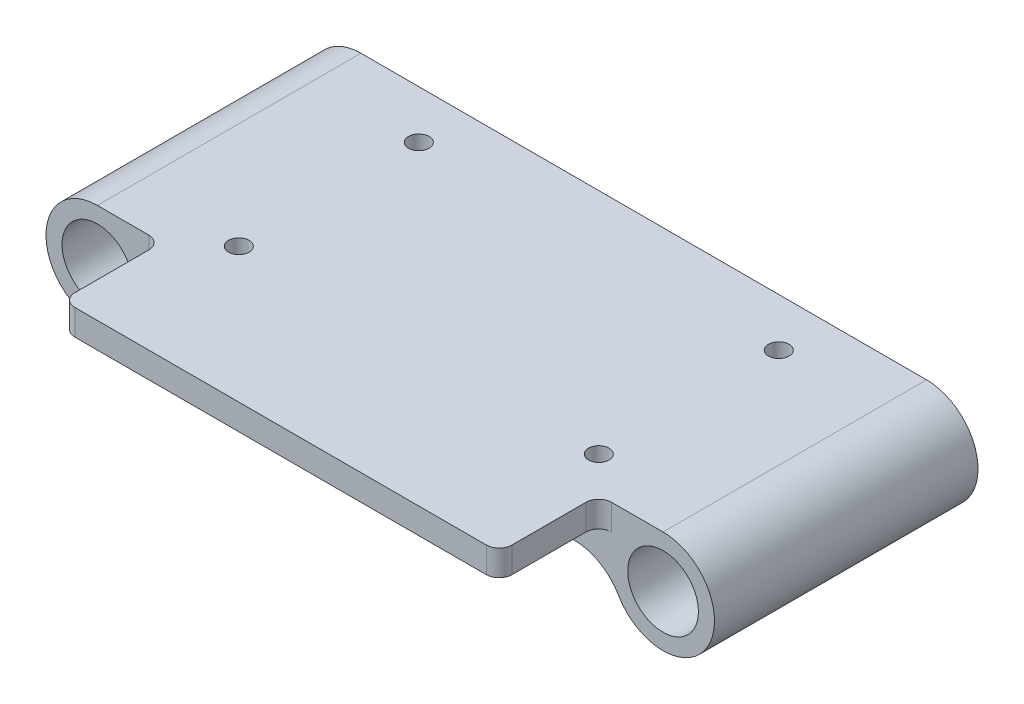
ISO-10303-21;
HEADER;
FILE_DESCRIPTION(('STEP AP214'),'2;1');
FILE_NAME('part.step','',(''),(''),'','','');
FILE_SCHEMA(('AUTOMOTIVE_DESIGN { 1 0 10303 214 1 1 1 1 }'));
ENDSEC;
DATA;
#1=APPLICATION_CONTEXT('core data for automotive mechanical design processes');
#2=APPLICATION_PROTOCOL_DEFINITION('international standard','automotive_design',2000,#1);
#3=PRODUCT_CONTEXT('',#1,'mechanical');
#4=PRODUCT('Part','Part','',(#3));
#5=PRODUCT_RELATED_PRODUCT_CATEGORY('part','',(#4));
#6=PRODUCT_DEFINITION_FORMATION('','',#4);
#7=PRODUCT_DEFINITION_CONTEXT('part definition',#1,'design');
#8=PRODUCT_DEFINITION('design','',#6,#7);
#9=PRODUCT_DEFINITION_SHAPE('','',#8);
#10=(LENGTH_UNIT() NAMED_UNIT(*) SI_UNIT(.MILLI.,.METRE.));
#11=(NAMED_UNIT(*) PLANE_ANGLE_UNIT() SI_UNIT($,.RADIAN.));
#12=(NAMED_UNIT(*) SI_UNIT($,.STERADIAN.) SOLID_ANGLE_UNIT());
#13=UNCERTAINTY_MEASURE_WITH_UNIT(LENGTH_MEASURE(1.E-05),#10,'distance_accuracy_value','');
#14=(GEOMETRIC_REPRESENTATION_CONTEXT(3) GLOBAL_UNCERTAINTY_ASSIGNED_CONTEXT((#13)) GLOBAL_UNIT_ASSIGNED_CONTEXT((#10,
#11,#12)) REPRESENTATION_CONTEXT('',''));
#15=CARTESIAN_POINT('',(0.,0.,0.));
#16=DIRECTION('',(0.,0.,1.));
#17=DIRECTION('',(1.,0.,0.));
#18=AXIS2_PLACEMENT_3D('',#15,#16,#17);
#19=CARTESIAN_POINT('',(-22.,0.,10.25));
#20=DIRECTION('',(0.,0.,-1.));
#21=DIRECTION('',(-1.,0.,0.));
#22=AXIS2_PLACEMENT_3D('',#19,#20,#21);
#23=CYLINDRICAL_SURFACE('',#22,4.);
#24=CARTESIAN_POINT('',(-22.,0.,-10.25));
#25=DIRECTION('',(0.,0.,1.));
#26=DIRECTION('',(1.,0.,0.));
#27=AXIS2_PLACEMENT_3D('',#24,#25,#26);
#28=CIRCLE('',#27,4.);
#29=CARTESIAN_POINT('',(-22.,4.,-10.25));
#30=VERTEX_POINT('',#29);
#31=CARTESIAN_POINT('',(-18.5358983848622,-2.,-10.25));
#32=VERTEX_POINT('',#31);
#33=EDGE_CURVE('E192',#30,#32,#28,.T.);
#34=ORIENTED_EDGE('',*,*,#33,.T.);
#35=DIRECTION('',(0.,0.,-1.));
#36=VECTOR('',#35,1.);
#37=CARTESIAN_POINT('',(-18.5358983848622,-2.,10.25));
#38=LINE('',#37,#36);
#39=CARTESIAN_POINT('',(-18.5358983848622,-2.,10.25));
#40=VERTEX_POINT('',#39);
#41=EDGE_CURVE('E217',#32,#40,#38,.F.);
#42=ORIENTED_EDGE('',*,*,#41,.T.);
#43=CARTESIAN_POINT('',(-22.,0.,10.25));
#44=DIRECTION('',(0.,0.,1.));
#45=DIRECTION('',(1.,0.,0.));
#46=AXIS2_PLACEMENT_3D('',#43,#44,#45);
#47=CIRCLE('',#46,4.);
#48=CARTESIAN_POINT('',(-22.,4.,10.25));
#49=VERTEX_POINT('',#48);
#50=EDGE_CURVE('E186',#49,#40,#47,.T.);
#51=ORIENTED_EDGE('',*,*,#50,.F.);
#52=DIRECTION('',(0.,0.,-1.));
#53=VECTOR('',#52,1.);
#54=CARTESIAN_POINT('',(-22.,4.,10.25));
#55=LINE('',#54,#53);
#56=EDGE_CURVE('E175',#49,#30,#55,.T.);
#57=ORIENTED_EDGE('',*,*,#56,.T.);
#58=EDGE_LOOP('',(#34,#42,#51,#57));
#59=FACE_BOUND('',#58,.T.);
#60=ADVANCED_FACE('F45',(#59),#23,.T.);
#61=CARTESIAN_POINT('',(0.,0.,10.25));
#62=DIRECTION('',(0.,-1.,0.));
#63=DIRECTION('',(0.,0.,-1.));
#64=AXIS2_PLACEMENT_3D('',#61,#62,#63);
#65=PLANE('',#64);
#66=CARTESIAN_POINT('',(14.25,0.,-6.500000018));
#67=DIRECTION('',(0.,-1.,0.));
#68=DIRECTION('',(0.,0.,-1.));
#69=AXIS2_PLACEMENT_3D('',#66,#67,#68);
#70=CIRCLE('',#69,0.799999999999999);
#71=CARTESIAN_POINT('',(14.25,0.,-7.300000018));
#72=VERTEX_POINT('',#71);
#73=EDGE_CURVE('E354',#72,#72,#70,.T.);
#74=ORIENTED_EDGE('',*,*,#73,.F.);
#75=EDGE_LOOP('',(#74));
#76=FACE_BOUND('',#75,.T.);
#77=CARTESIAN_POINT('',(14.25,0.,7.499999982));
#78=DIRECTION('',(0.,-1.,0.));
#79=DIRECTION('',(0.,0.,-1.));
#80=AXIS2_PLACEMENT_3D('',#77,#78,#79);
#81=CIRCLE('',#80,0.799999999999999);
#82=CARTESIAN_POINT('',(14.25,0.,6.699999982));
#83=VERTEX_POINT('',#82);
#84=EDGE_CURVE('E346',#83,#83,#81,.T.);
#85=ORIENTED_EDGE('',*,*,#84,.F.);
#86=EDGE_LOOP('',(#85));
#87=FACE_BOUND('',#86,.T.);
#88=CARTESIAN_POINT('',(-13.75,0.,7.499999982));
#89=DIRECTION('',(0.,-1.,0.));
#90=DIRECTION('',(0.,0.,-1.));
#91=AXIS2_PLACEMENT_3D('',#88,#89,#90);
#92=CIRCLE('',#91,0.799999999999999);
#93=CARTESIAN_POINT('',(-13.75,0.,6.69999998200001));
#94=VERTEX_POINT('',#93);
#95=EDGE_CURVE('E338',#94,#94,#92,.T.);
#96=ORIENTED_EDGE('',*,*,#95,.F.);
#97=EDGE_LOOP('',(#96));
#98=FACE_BOUND('',#97,.T.);
#99=CARTESIAN_POINT('',(-13.75,0.,-6.500000018));
#100=DIRECTION('',(0.,-1.,0.));
#101=DIRECTION('',(0.,0.,-1.));
#102=AXIS2_PLACEMENT_3D('',#99,#100,#101);
#103=CIRCLE('',#102,0.799999999999999);
#104=CARTESIAN_POINT('',(-13.75,0.,-7.300000018));
#105=VERTEX_POINT('',#104);
#106=EDGE_CURVE('E330',#105,#105,#103,.T.);
#107=ORIENTED_EDGE('',*,*,#106,.F.);
#108=EDGE_LOOP('',(#107));
#109=FACE_BOUND('',#108,.T.);
#110=DIRECTION('',(-1.,0.,0.));
#111=VECTOR('',#110,1.);
#112=CARTESIAN_POINT('',(0.,0.,-10.25));
#113=LINE('',#112,#111);
#114=CARTESIAN_POINT('',(15.0717967697245,0.,-10.25));
#115=VERTEX_POINT('',#114);
#116=CARTESIAN_POINT('',(-15.0717967697245,0.,-10.25));
#117=VERTEX_POINT('',#116);
#118=EDGE_CURVE('E196',#115,#117,#113,.T.);
#119=ORIENTED_EDGE('',*,*,#118,.F.);
#120=DIRECTION('',(0.,0.,1.));
#121=VECTOR('',#120,1.);
#122=CARTESIAN_POINT('',(15.0717967697245,0.,10.25));
#123=LINE('',#122,#121);
#124=CARTESIAN_POINT('',(15.0717967697245,0.,10.25));
#125=VERTEX_POINT('',#124);
#126=EDGE_CURVE('E214',#115,#125,#123,.T.);
#127=ORIENTED_EDGE('',*,*,#126,.T.);
#128=DIRECTION('',(-1.,0.,0.));
#129=VECTOR('',#128,1.);
#130=CARTESIAN_POINT('',(0.,0.,10.25));
#131=LINE('',#130,#129);
#132=CARTESIAN_POINT('',(-15.0717967697245,0.,10.25));
#133=VERTEX_POINT('',#132);
#134=EDGE_CURVE('E182',#125,#133,#131,.T.);
#135=ORIENTED_EDGE('',*,*,#134,.T.);
#136=DIRECTION('',(0.,0.,-1.));
#137=VECTOR('',#136,1.);
#138=CARTESIAN_POINT('',(-15.0717967697245,0.,10.25));
#139=LINE('',#138,#137);
#140=EDGE_CURVE('E210',#133,#117,#139,.T.);
#141=ORIENTED_EDGE('',*,*,#140,.T.);
#142=EDGE_LOOP('',(#119,#127,#135,#141));
#143=FACE_BOUND('',#142,.T.);
#144=ADVANCED_FACE('F391',(#76,#87,#98,#109,#143),#65,.T.);
#145=CARTESIAN_POINT('',(22.,0.,10.25));
#146=DIRECTION('',(0.,0.,-1.));
#147=DIRECTION('',(-1.,0.,0.));
#148=AXIS2_PLACEMENT_3D('',#145,#146,#147);
#149=CYLINDRICAL_SURFACE('',#148,4.);
#150=CARTESIAN_POINT('',(22.,0.,10.25));
#151=DIRECTION('',(0.,0.,1.));
#152=DIRECTION('',(1.,0.,0.));
#153=AXIS2_PLACEMENT_3D('',#150,#151,#152);
#154=CIRCLE('',#153,4.);
#155=CARTESIAN_POINT('',(22.,4.,10.25));
#156=VERTEX_POINT('',#155);
#157=CARTESIAN_POINT('',(18.5358983848622,-2.,10.25));
#158=VERTEX_POINT('',#157);
#159=EDGE_CURVE('E163',#156,#158,#154,.F.);
#160=ORIENTED_EDGE('',*,*,#159,.T.);
#161=DIRECTION('',(0.,0.,-1.));
#162=VECTOR('',#161,1.);
#163=CARTESIAN_POINT('',(18.5358983848622,-2.,10.25));
#164=LINE('',#163,#162);
#165=CARTESIAN_POINT('',(18.5358983848622,-2.,-10.25));
#166=VERTEX_POINT('',#165);
#167=EDGE_CURVE('E174',#158,#166,#164,.T.);
#168=ORIENTED_EDGE('',*,*,#167,.T.);
#169=CARTESIAN_POINT('',(22.,0.,-10.25));
#170=DIRECTION('',(0.,0.,1.));
#171=DIRECTION('',(1.,0.,0.));
#172=AXIS2_PLACEMENT_3D('',#169,#170,#171);
#173=CIRCLE('',#172,4.);
#174=CARTESIAN_POINT('',(22.,4.,-10.25));
#175=VERTEX_POINT('',#174);
#176=EDGE_CURVE('E171',#175,#166,#173,.F.);
#177=ORIENTED_EDGE('',*,*,#176,.F.);
#178=DIRECTION('',(0.,0.,-1.));
#179=VECTOR('',#178,1.);
#180=CARTESIAN_POINT('',(22.,4.,10.25));
#181=LINE('',#180,#179);
#182=EDGE_CURVE('E152',#156,#175,#181,.T.);
#183=ORIENTED_EDGE('',*,*,#182,.F.);
#184=EDGE_LOOP('',(#160,#168,#177,#183));
#185=FACE_BOUND('',#184,.T.);
#186=ADVANCED_FACE('F167',(#185),#149,.T.);
#187=CARTESIAN_POINT('',(0.,4.,10.25));
#188=DIRECTION('',(0.,1.,0.));
#189=DIRECTION('',(-1.,0.,0.));
#190=AXIS2_PLACEMENT_3D('',#187,#188,#189);
#191=PLANE('',#190);
#192=CARTESIAN_POINT('',(14.25,4.,-6.500000018));
#193=DIRECTION('',(0.,1.,0.));
#194=DIRECTION('',(0.,0.,1.));
#195=AXIS2_PLACEMENT_3D('',#192,#193,#194);
#196=CIRCLE('',#195,0.799999999999999);
#197=CARTESIAN_POINT('',(14.25,4.,-5.700000018));
#198=VERTEX_POINT('',#197);
#199=EDGE_CURVE('E358',#198,#198,#196,.T.);
#200=ORIENTED_EDGE('',*,*,#199,.F.);
#201=EDGE_LOOP('',(#200));
#202=FACE_BOUND('',#201,.T.);
#203=CARTESIAN_POINT('',(14.25,4.,7.499999982));
#204=DIRECTION('',(0.,1.,0.));
#205=DIRECTION('',(0.,0.,1.));
#206=AXIS2_PLACEMENT_3D('',#203,#204,#205);
#207=CIRCLE('',#206,0.799999999999999);
#208=CARTESIAN_POINT('',(14.25,4.,8.299999982));
#209=VERTEX_POINT('',#208);
#210=EDGE_CURVE('E350',#209,#209,#207,.T.);
#211=ORIENTED_EDGE('',*,*,#210,.F.);
#212=EDGE_LOOP('',(#211));
#213=FACE_BOUND('',#212,.T.);
#214=CARTESIAN_POINT('',(-13.75,4.,7.499999982));
#215=DIRECTION('',(0.,1.,0.));
#216=DIRECTION('',(0.,0.,1.));
#217=AXIS2_PLACEMENT_3D('',#214,#215,#216);
#218=CIRCLE('',#217,0.799999999999999);
#219=CARTESIAN_POINT('',(-13.75,4.,8.299999982));
#220=VERTEX_POINT('',#219);
#221=EDGE_CURVE('E342',#220,#220,#218,.T.);
#222=ORIENTED_EDGE('',*,*,#221,.F.);
#223=EDGE_LOOP('',(#222));
#224=FACE_BOUND('',#223,.T.);
#225=CARTESIAN_POINT('',(-13.75,4.,-6.500000018));
#226=DIRECTION('',(0.,1.,0.));
#227=DIRECTION('',(0.,0.,1.));
#228=AXIS2_PLACEMENT_3D('',#225,#226,#227);
#229=CIRCLE('',#228,0.799999999999999);
#230=CARTESIAN_POINT('',(-13.75,4.,-5.700000018));
#231=VERTEX_POINT('',#230);
#232=EDGE_CURVE('E334',#231,#231,#229,.T.);
#233=ORIENTED_EDGE('',*,*,#232,.F.);
#234=EDGE_LOOP('',(#233));
#235=FACE_BOUND('',#234,.T.);
#236=DIRECTION('',(0.,0.,1.));
#237=VECTOR('',#236,1.);
#238=CARTESIAN_POINT('',(-17.,4.,0.));
#239=LINE('',#238,#237);
#240=CARTESIAN_POINT('',(-17.,4.,11.25));
#241=VERTEX_POINT('',#240);
#242=CARTESIAN_POINT('',(-16.9999999999999,4.,17.));
#243=VERTEX_POINT('',#242);
#244=EDGE_CURVE('E297',#241,#243,#239,.T.);
#245=ORIENTED_EDGE('',*,*,#244,.T.);
#246=CARTESIAN_POINT('',(-15.9999999999999,4.,17.));
#247=DIRECTION('',(0.,1.,0.));
#248=DIRECTION('',(-1.,0.,0.));
#249=AXIS2_PLACEMENT_3D('',#246,#247,#248);
#250=CIRCLE('',#249,1.);
#251=CARTESIAN_POINT('',(-15.9999999999999,3.99999999999999,18.));
#252=VERTEX_POINT('',#251);
#253=EDGE_CURVE('E264',#243,#252,#250,.T.);
#254=ORIENTED_EDGE('',*,*,#253,.T.);
#255=DIRECTION('',(1.,0.,0.));
#256=VECTOR('',#255,1.);
#257=CARTESIAN_POINT('',(0.,4.,18.));
#258=LINE('',#257,#256);
#259=CARTESIAN_POINT('',(15.9999999999999,4.,18.));
#260=VERTEX_POINT('',#259);
#261=EDGE_CURVE('E197',#252,#260,#258,.T.);
#262=ORIENTED_EDGE('',*,*,#261,.T.);
#263=CARTESIAN_POINT('',(15.9999999999999,4.,17.));
#264=DIRECTION('',(0.,1.,0.));
#265=DIRECTION('',(-1.,0.,0.));
#266=AXIS2_PLACEMENT_3D('',#263,#264,#265);
#267=CIRCLE('',#266,1.);
#268=CARTESIAN_POINT('',(16.9999999999999,4.,17.));
#269=VERTEX_POINT('',#268);
#270=EDGE_CURVE('E261',#260,#269,#267,.T.);
#271=ORIENTED_EDGE('',*,*,#270,.T.);
#272=DIRECTION('',(0.,0.,1.));
#273=VECTOR('',#272,1.);
#274=CARTESIAN_POINT('',(17.,4.,0.));
#275=LINE('',#274,#273);
#276=CARTESIAN_POINT('',(17.,4.,11.25));
#277=VERTEX_POINT('',#276);
#278=EDGE_CURVE('E298',#277,#269,#275,.T.);
#279=ORIENTED_EDGE('',*,*,#278,.F.);
#280=CARTESIAN_POINT('',(18.,4.,11.25));
#281=DIRECTION('',(0.,1.,0.));
#282=DIRECTION('',(-1.,0.,0.));
#283=AXIS2_PLACEMENT_3D('',#280,#281,#282);
#284=CIRCLE('',#283,1.);
#285=CARTESIAN_POINT('',(18.,4.,10.25));
#286=VERTEX_POINT('',#285);
#287=EDGE_CURVE('E156',#277,#286,#284,.F.);
#288=ORIENTED_EDGE('',*,*,#287,.T.);
#289=DIRECTION('',(1.,0.,0.));
#290=VECTOR('',#289,1.);
#291=CARTESIAN_POINT('',(0.,4.,10.25));
#292=LINE('',#291,#290);
#293=EDGE_CURVE('E147',#286,#156,#292,.T.);
#294=ORIENTED_EDGE('',*,*,#293,.T.);
#295=ORIENTED_EDGE('',*,*,#182,.T.);
#296=DIRECTION('',(1.,0.,0.));
#297=VECTOR('',#296,1.);
#298=CARTESIAN_POINT('',(0.,4.,-10.25));
#299=LINE('',#298,#297);
#300=EDGE_CURVE('E203',#30,#175,#299,.T.);
#301=ORIENTED_EDGE('',*,*,#300,.F.);
#302=ORIENTED_EDGE('',*,*,#56,.F.);
#303=CARTESIAN_POINT('',(-18.,4.,10.25));
#304=VERTEX_POINT('',#303);
#305=EDGE_CURVE('E162',#49,#304,#292,.T.);
#306=ORIENTED_EDGE('',*,*,#305,.T.);
#307=CARTESIAN_POINT('',(-18.,4.,11.25));
#308=DIRECTION('',(0.,1.,0.));
#309=DIRECTION('',(-1.,0.,0.));
#310=AXIS2_PLACEMENT_3D('',#307,#308,#309);
#311=CIRCLE('',#310,1.);
#312=EDGE_CURVE('E11',#304,#241,#311,.F.);
#313=ORIENTED_EDGE('',*,*,#312,.T.);
#314=EDGE_LOOP('',(#245,#254,#262,#271,#279,#288,#294,#295,#301,#302,#306,#313));
#315=FACE_BOUND('',#314,.T.);
#316=ADVANCED_FACE('F150',(#202,#213,#224,#235,#315),#191,.T.);
#317=CARTESIAN_POINT('',(0.,0.,10.25));
#318=DIRECTION('',(0.,0.,1.));
#319=DIRECTION('',(1.,0.,0.));
#320=AXIS2_PLACEMENT_3D('',#317,#318,#319);
#321=PLANE('',#320);
#322=CARTESIAN_POINT('',(-22.,0.,10.25));
#323=DIRECTION('',(0.,0.,1.));
#324=DIRECTION('',(1.,0.,0.));
#325=AXIS2_PLACEMENT_3D('',#322,#323,#324);
#326=CIRCLE('',#325,2.75);
#327=CARTESIAN_POINT('',(-19.25,0.,10.25));
#328=VERTEX_POINT('',#327);
#329=EDGE_CURVE('E326',#328,#328,#326,.T.);
#330=ORIENTED_EDGE('',*,*,#329,.F.);
#331=EDGE_LOOP('',(#330));
#332=FACE_BOUND('',#331,.T.);
#333=CARTESIAN_POINT('',(22.,0.,10.25));
#334=DIRECTION('',(0.,0.,1.));
#335=DIRECTION('',(1.,0.,0.));
#336=AXIS2_PLACEMENT_3D('',#333,#334,#335);
#337=CIRCLE('',#336,2.75);
#338=CARTESIAN_POINT('',(24.75,0.,10.25));
#339=VERTEX_POINT('',#338);
#340=EDGE_CURVE('E318',#339,#339,#337,.T.);
#341=ORIENTED_EDGE('',*,*,#340,.F.);
#342=EDGE_LOOP('',(#341));
#343=FACE_BOUND('',#342,.T.);
#344=ORIENTED_EDGE('',*,*,#293,.F.);
#345=DIRECTION('',(0.,-1.,0.));
#346=VECTOR('',#345,1.);
#347=CARTESIAN_POINT('',(18.,2.,10.25));
#348=LINE('',#347,#346);
#349=CARTESIAN_POINT('',(18.,2.,10.25));
#350=VERTEX_POINT('',#349);
#351=EDGE_CURVE('E234',#286,#350,#348,.T.);
#352=ORIENTED_EDGE('',*,*,#351,.T.);
#353=DIRECTION('',(1.,0.,0.));
#354=VECTOR('',#353,1.);
#355=CARTESIAN_POINT('',(0.,2.,10.25));
#356=LINE('',#355,#354);
#357=CARTESIAN_POINT('',(-18.,2.,10.25));
#358=VERTEX_POINT('',#357);
#359=EDGE_CURVE('E276',#358,#350,#356,.T.);
#360=ORIENTED_EDGE('',*,*,#359,.F.);
#361=DIRECTION('',(0.,-1.,0.));
#362=VECTOR('',#361,1.);
#363=CARTESIAN_POINT('',(-18.,0.,10.25));
#364=LINE('',#363,#362);
#365=EDGE_CURVE('E231',#358,#304,#364,.F.);
#366=ORIENTED_EDGE('',*,*,#365,.T.);
#367=ORIENTED_EDGE('',*,*,#305,.F.);
#368=ORIENTED_EDGE('',*,*,#50,.T.);
#369=CARTESIAN_POINT('',(-15.0717967697245,-4.,10.25));
#370=DIRECTION('',(0.,0.,1.));
#371=DIRECTION('',(1.,0.,0.));
#372=AXIS2_PLACEMENT_3D('',#369,#370,#371);
#373=CIRCLE('',#372,4.);
#374=EDGE_CURVE('E228',#40,#133,#373,.F.);
#375=ORIENTED_EDGE('',*,*,#374,.T.);
#376=ORIENTED_EDGE('',*,*,#134,.F.);
#377=CARTESIAN_POINT('',(15.0717967697245,-4.,10.25));
#378=DIRECTION('',(0.,0.,1.));
#379=DIRECTION('',(1.,0.,0.));
#380=AXIS2_PLACEMENT_3D('',#377,#378,#379);
#381=CIRCLE('',#380,4.);
#382=EDGE_CURVE('E180',#125,#158,#381,.F.);
#383=ORIENTED_EDGE('',*,*,#382,.T.);
#384=ORIENTED_EDGE('',*,*,#159,.F.);
#385=EDGE_LOOP('',(#344,#352,#360,#366,#367,#368,#375,#376,#383,#384));
#386=FACE_BOUND('',#385,.T.);
#387=ADVANCED_FACE('F177',(#332,#343,#386),#321,.T.);
#388=CARTESIAN_POINT('',(0.,0.,-10.25));
#389=DIRECTION('',(0.,0.,1.));
#390=DIRECTION('',(1.,0.,0.));
#391=AXIS2_PLACEMENT_3D('',#388,#389,#390);
#392=PLANE('',#391);
#393=CARTESIAN_POINT('',(-22.,0.,-10.25));
#394=DIRECTION('',(0.,0.,1.));
#395=DIRECTION('',(1.,0.,0.));
#396=AXIS2_PLACEMENT_3D('',#393,#394,#395);
#397=CIRCLE('',#396,2.75);
#398=CARTESIAN_POINT('',(-19.25,0.,-10.25));
#399=VERTEX_POINT('',#398);
#400=EDGE_CURVE('E322',#399,#399,#397,.T.);
#401=ORIENTED_EDGE('',*,*,#400,.T.);
#402=EDGE_LOOP('',(#401));
#403=FACE_BOUND('',#402,.T.);
#404=CARTESIAN_POINT('',(22.,0.,-10.25));
#405=DIRECTION('',(0.,0.,1.));
#406=DIRECTION('',(1.,0.,0.));
#407=AXIS2_PLACEMENT_3D('',#404,#405,#406);
#408=CIRCLE('',#407,2.75);
#409=CARTESIAN_POINT('',(24.75,0.,-10.25));
#410=VERTEX_POINT('',#409);
#411=EDGE_CURVE('E302',#410,#410,#408,.T.);
#412=ORIENTED_EDGE('',*,*,#411,.T.);
#413=EDGE_LOOP('',(#412));
#414=FACE_BOUND('',#413,.T.);
#415=ORIENTED_EDGE('',*,*,#33,.F.);
#416=ORIENTED_EDGE('',*,*,#300,.T.);
#417=ORIENTED_EDGE('',*,*,#176,.T.);
#418=CARTESIAN_POINT('',(15.0717967697245,-4.,-10.25));
#419=DIRECTION('',(0.,0.,1.));
#420=DIRECTION('',(1.,0.,0.));
#421=AXIS2_PLACEMENT_3D('',#418,#419,#420);
#422=CIRCLE('',#421,4.);
#423=EDGE_CURVE('E220',#166,#115,#422,.T.);
#424=ORIENTED_EDGE('',*,*,#423,.T.);
#425=ORIENTED_EDGE('',*,*,#118,.T.);
#426=CARTESIAN_POINT('',(-15.0717967697245,-4.,-10.25));
#427=DIRECTION('',(0.,0.,1.));
#428=DIRECTION('',(1.,0.,0.));
#429=AXIS2_PLACEMENT_3D('',#426,#427,#428);
#430=CIRCLE('',#429,4.);
#431=EDGE_CURVE('E225',#117,#32,#430,.T.);
#432=ORIENTED_EDGE('',*,*,#431,.T.);
#433=EDGE_LOOP('',(#415,#416,#417,#424,#425,#432));
#434=FACE_BOUND('',#433,.T.);
#435=ADVANCED_FACE('F404',(#403,#414,#434),#392,.F.);
#436=CARTESIAN_POINT('',(15.0717967697245,-4.,10.25));
#437=DIRECTION('',(0.,0.,-1.));
#438=DIRECTION('',(-1.,0.,0.));
#439=AXIS2_PLACEMENT_3D('',#436,#437,#438);
#440=CYLINDRICAL_SURFACE('',#439,4.);
#441=ORIENTED_EDGE('',*,*,#382,.F.);
#442=ORIENTED_EDGE('',*,*,#126,.F.);
#443=ORIENTED_EDGE('',*,*,#423,.F.);
#444=ORIENTED_EDGE('',*,*,#167,.F.);
#445=EDGE_LOOP('',(#441,#442,#443,#444));
#446=FACE_BOUND('',#445,.T.);
#447=ADVANCED_FACE('F400',(#446),#440,.F.);
#448=CARTESIAN_POINT('',(-15.0717967697245,-4.,10.25));
#449=DIRECTION('',(0.,0.,-1.));
#450=DIRECTION('',(-1.,0.,0.));
#451=AXIS2_PLACEMENT_3D('',#448,#449,#450);
#452=CYLINDRICAL_SURFACE('',#451,4.);
#453=ORIENTED_EDGE('',*,*,#374,.F.);
#454=ORIENTED_EDGE('',*,*,#41,.F.);
#455=ORIENTED_EDGE('',*,*,#431,.F.);
#456=ORIENTED_EDGE('',*,*,#140,.F.);
#457=EDGE_LOOP('',(#453,#454,#455,#456));
#458=FACE_BOUND('',#457,.T.);
#459=ADVANCED_FACE('F403',(#458),#452,.F.);
#460=CARTESIAN_POINT('',(17.,38.8720876920209,0.));
#461=DIRECTION('',(1.,0.,0.));
#462=DIRECTION('',(0.,0.,-1.));
#463=AXIS2_PLACEMENT_3D('',#460,#461,#462);
#464=PLANE('',#463);
#465=DIRECTION('',(0.,0.,1.));
#466=VECTOR('',#465,1.);
#467=CARTESIAN_POINT('',(17.,2.,0.));
#468=LINE('',#467,#466);
#469=CARTESIAN_POINT('',(17.,2.,11.25));
#470=VERTEX_POINT('',#469);
#471=CARTESIAN_POINT('',(16.9999999999999,2.,17.));
#472=VERTEX_POINT('',#471);
#473=EDGE_CURVE('E305',#470,#472,#468,.T.);
#474=ORIENTED_EDGE('',*,*,#473,.F.);
#475=DIRECTION('',(0.,-1.,0.));
#476=VECTOR('',#475,1.);
#477=CARTESIAN_POINT('',(17.,4.,11.25));
#478=LINE('',#477,#476);
#479=EDGE_CURVE('E241',#470,#277,#478,.F.);
#480=ORIENTED_EDGE('',*,*,#479,.T.);
#481=ORIENTED_EDGE('',*,*,#278,.T.);
#482=DIRECTION('',(0.,-1.,0.));
#483=VECTOR('',#482,1.);
#484=CARTESIAN_POINT('',(16.9999999999999,2.,17.));
#485=LINE('',#484,#483);
#486=EDGE_CURVE('E237',#269,#472,#485,.T.);
#487=ORIENTED_EDGE('',*,*,#486,.T.);
#488=EDGE_LOOP('',(#474,#480,#481,#487));
#489=FACE_BOUND('',#488,.T.);
#490=ADVANCED_FACE('F408',(#489),#464,.T.);
#491=CARTESIAN_POINT('',(-17.,38.8720876920209,0.));
#492=DIRECTION('',(1.,0.,0.));
#493=DIRECTION('',(0.,0.,-1.));
#494=AXIS2_PLACEMENT_3D('',#491,#492,#493);
#495=PLANE('',#494);
#496=ORIENTED_EDGE('',*,*,#244,.F.);
#497=DIRECTION('',(0.,-1.,0.));
#498=VECTOR('',#497,1.);
#499=CARTESIAN_POINT('',(-17.,38.8720876920209,11.25));
#500=LINE('',#499,#498);
#501=CARTESIAN_POINT('',(-17.,2.,11.25));
#502=VERTEX_POINT('',#501);
#503=EDGE_CURVE('E247',#241,#502,#500,.T.);
#504=ORIENTED_EDGE('',*,*,#503,.T.);
#505=DIRECTION('',(0.,0.,1.));
#506=VECTOR('',#505,1.);
#507=CARTESIAN_POINT('',(-17.,2.,0.));
#508=LINE('',#507,#506);
#509=CARTESIAN_POINT('',(-16.9999999999999,2.,17.));
#510=VERTEX_POINT('',#509);
#511=EDGE_CURVE('E279',#502,#510,#508,.T.);
#512=ORIENTED_EDGE('',*,*,#511,.T.);
#513=DIRECTION('',(0.,-1.,0.));
#514=VECTOR('',#513,1.);
#515=CARTESIAN_POINT('',(-16.9999999999999,38.8720876920209,17.));
#516=LINE('',#515,#514);
#517=EDGE_CURVE('E244',#510,#243,#516,.F.);
#518=ORIENTED_EDGE('',*,*,#517,.T.);
#519=EDGE_LOOP('',(#496,#504,#512,#518));
#520=FACE_BOUND('',#519,.T.);
#521=ADVANCED_FACE('F432',(#520),#495,.F.);
#522=CARTESIAN_POINT('',(0.,38.8720876920209,18.));
#523=DIRECTION('',(0.,0.,-1.));
#524=DIRECTION('',(-1.,0.,0.));
#525=AXIS2_PLACEMENT_3D('',#522,#523,#524);
#526=PLANE('',#525);
#527=ORIENTED_EDGE('',*,*,#261,.F.);
#528=DIRECTION('',(0.,-1.,0.));
#529=VECTOR('',#528,1.);
#530=CARTESIAN_POINT('',(-15.9999999999999,38.8720876920209,18.));
#531=LINE('',#530,#529);
#532=CARTESIAN_POINT('',(-15.9999999999999,2.,18.));
#533=VERTEX_POINT('',#532);
#534=EDGE_CURVE('E254',#252,#533,#531,.T.);
#535=ORIENTED_EDGE('',*,*,#534,.T.);
#536=DIRECTION('',(1.,0.,0.));
#537=VECTOR('',#536,1.);
#538=CARTESIAN_POINT('',(0.,2.,18.));
#539=LINE('',#538,#537);
#540=CARTESIAN_POINT('',(15.9999999999999,2.,18.));
#541=VERTEX_POINT('',#540);
#542=EDGE_CURVE('E308',#533,#541,#539,.T.);
#543=ORIENTED_EDGE('',*,*,#542,.T.);
#544=DIRECTION('',(0.,-1.,0.));
#545=VECTOR('',#544,1.);
#546=CARTESIAN_POINT('',(15.9999999999999,4.,18.));
#547=LINE('',#546,#545);
#548=EDGE_CURVE('E251',#541,#260,#547,.F.);
#549=ORIENTED_EDGE('',*,*,#548,.T.);
#550=EDGE_LOOP('',(#527,#535,#543,#549));
#551=FACE_BOUND('',#550,.T.);
#552=ADVANCED_FACE('F425',(#551),#526,.F.);
#553=CARTESIAN_POINT('',(0.,2.,0.));
#554=DIRECTION('',(0.,1.,0.));
#555=DIRECTION('',(0.,0.,1.));
#556=AXIS2_PLACEMENT_3D('',#553,#554,#555);
#557=PLANE('',#556);
#558=ORIENTED_EDGE('',*,*,#542,.F.);
#559=CARTESIAN_POINT('',(-15.9999999999999,2.,17.));
#560=DIRECTION('',(0.,1.,0.));
#561=DIRECTION('',(0.,0.,1.));
#562=AXIS2_PLACEMENT_3D('',#559,#560,#561);
#563=CIRCLE('',#562,1.);
#564=EDGE_CURVE('E69',#533,#510,#563,.F.);
#565=ORIENTED_EDGE('',*,*,#564,.T.);
#566=ORIENTED_EDGE('',*,*,#511,.F.);
#567=CARTESIAN_POINT('',(-18.,2.,11.25));
#568=DIRECTION('',(0.,1.,0.));
#569=DIRECTION('',(0.,0.,1.));
#570=AXIS2_PLACEMENT_3D('',#567,#568,#569);
#571=CIRCLE('',#570,1.);
#572=EDGE_CURVE('E54',#502,#358,#571,.T.);
#573=ORIENTED_EDGE('',*,*,#572,.T.);
#574=ORIENTED_EDGE('',*,*,#359,.T.);
#575=CARTESIAN_POINT('',(18.,2.,11.25));
#576=DIRECTION('',(0.,1.,0.));
#577=DIRECTION('',(0.,0.,1.));
#578=AXIS2_PLACEMENT_3D('',#575,#576,#577);
#579=CIRCLE('',#578,1.);
#580=EDGE_CURVE('E267',#350,#470,#579,.T.);
#581=ORIENTED_EDGE('',*,*,#580,.T.);
#582=ORIENTED_EDGE('',*,*,#473,.T.);
#583=CARTESIAN_POINT('',(15.9999999999999,2.,17.));
#584=DIRECTION('',(0.,1.,0.));
#585=DIRECTION('',(0.,0.,1.));
#586=AXIS2_PLACEMENT_3D('',#583,#584,#585);
#587=CIRCLE('',#586,1.);
#588=EDGE_CURVE('E61',#472,#541,#587,.F.);
#589=ORIENTED_EDGE('',*,*,#588,.T.);
#590=EDGE_LOOP('',(#558,#565,#566,#573,#574,#581,#582,#589));
#591=FACE_BOUND('',#590,.T.);
#592=ADVANCED_FACE('F275',(#591),#557,.F.);
#593=CARTESIAN_POINT('',(22.,0.,10.25));
#594=DIRECTION('',(0.,0.,1.));
#595=DIRECTION('',(1.,0.,0.));
#596=AXIS2_PLACEMENT_3D('',#593,#594,#595);
#597=CYLINDRICAL_SURFACE('',#596,2.75);
#598=ORIENTED_EDGE('',*,*,#411,.F.);
#599=EDGE_LOOP('',(#598));
#600=FACE_BOUND('',#599,.T.);
#601=ORIENTED_EDGE('',*,*,#340,.T.);
#602=EDGE_LOOP('',(#601));
#603=FACE_BOUND('',#602,.T.);
#604=ADVANCED_FACE('F387',(#600,#603),#597,.F.);
#605=CARTESIAN_POINT('',(-22.,0.,10.25));
#606=DIRECTION('',(0.,0.,1.));
#607=DIRECTION('',(1.,0.,0.));
#608=AXIS2_PLACEMENT_3D('',#605,#606,#607);
#609=CYLINDRICAL_SURFACE('',#608,2.75);
#610=ORIENTED_EDGE('',*,*,#400,.F.);
#611=EDGE_LOOP('',(#610));
#612=FACE_BOUND('',#611,.T.);
#613=ORIENTED_EDGE('',*,*,#329,.T.);
#614=EDGE_LOOP('',(#613));
#615=FACE_BOUND('',#614,.T.);
#616=ADVANCED_FACE('F377',(#612,#615),#609,.F.);
#617=CARTESIAN_POINT('',(-13.75,4.,-6.500000018));
#618=DIRECTION('',(0.,1.,0.));
#619=DIRECTION('',(0.,0.,1.));
#620=AXIS2_PLACEMENT_3D('',#617,#618,#619);
#621=CYLINDRICAL_SURFACE('',#620,0.799999999999999);
#622=ORIENTED_EDGE('',*,*,#106,.T.);
#623=EDGE_LOOP('',(#622));
#624=FACE_BOUND('',#623,.T.);
#625=ORIENTED_EDGE('',*,*,#232,.T.);
#626=EDGE_LOOP('',(#625));
#627=FACE_BOUND('',#626,.T.);
#628=ADVANCED_FACE('F374',(#624,#627),#621,.F.);
#629=CARTESIAN_POINT('',(-13.75,4.,7.499999982));
#630=DIRECTION('',(0.,1.,0.));
#631=DIRECTION('',(0.,0.,1.));
#632=AXIS2_PLACEMENT_3D('',#629,#630,#631);
#633=CYLINDRICAL_SURFACE('',#632,0.799999999999999);
#634=ORIENTED_EDGE('',*,*,#95,.T.);
#635=EDGE_LOOP('',(#634));
#636=FACE_BOUND('',#635,.T.);
#637=ORIENTED_EDGE('',*,*,#221,.T.);
#638=EDGE_LOOP('',(#637));
#639=FACE_BOUND('',#638,.T.);
#640=ADVANCED_FACE('F376',(#636,#639),#633,.F.);
#641=CARTESIAN_POINT('',(14.25,4.,7.499999982));
#642=DIRECTION('',(0.,1.,0.));
#643=DIRECTION('',(0.,0.,1.));
#644=AXIS2_PLACEMENT_3D('',#641,#642,#643);
#645=CYLINDRICAL_SURFACE('',#644,0.799999999999999);
#646=ORIENTED_EDGE('',*,*,#84,.T.);
#647=EDGE_LOOP('',(#646));
#648=FACE_BOUND('',#647,.T.);
#649=ORIENTED_EDGE('',*,*,#210,.T.);
#650=EDGE_LOOP('',(#649));
#651=FACE_BOUND('',#650,.T.);
#652=ADVANCED_FACE('F384',(#648,#651),#645,.F.);
#653=CARTESIAN_POINT('',(14.25,4.,-6.500000018));
#654=DIRECTION('',(0.,1.,0.));
#655=DIRECTION('',(0.,0.,1.));
#656=AXIS2_PLACEMENT_3D('',#653,#654,#655);
#657=CYLINDRICAL_SURFACE('',#656,0.799999999999999);
#658=ORIENTED_EDGE('',*,*,#73,.T.);
#659=EDGE_LOOP('',(#658));
#660=FACE_BOUND('',#659,.T.);
#661=ORIENTED_EDGE('',*,*,#199,.T.);
#662=EDGE_LOOP('',(#661));
#663=FACE_BOUND('',#662,.T.);
#664=ADVANCED_FACE('F363',(#660,#663),#657,.F.);
#665=CARTESIAN_POINT('',(18.,0.,11.25));
#666=DIRECTION('',(0.,1.,0.));
#667=DIRECTION('',(0.,0.,1.));
#668=AXIS2_PLACEMENT_3D('',#665,#666,#667);
#669=CYLINDRICAL_SURFACE('',#668,1.);
#670=ORIENTED_EDGE('',*,*,#287,.F.);
#671=ORIENTED_EDGE('',*,*,#479,.F.);
#672=ORIENTED_EDGE('',*,*,#580,.F.);
#673=ORIENTED_EDGE('',*,*,#351,.F.);
#674=EDGE_LOOP('',(#670,#671,#672,#673));
#675=FACE_BOUND('',#674,.T.);
#676=ADVANCED_FACE('F410',(#675),#669,.F.);
#677=CARTESIAN_POINT('',(-18.,38.8720876920209,11.25));
#678=DIRECTION('',(0.,-1.,0.));
#679=DIRECTION('',(0.,0.,-1.));
#680=AXIS2_PLACEMENT_3D('',#677,#678,#679);
#681=CYLINDRICAL_SURFACE('',#680,1.);
#682=ORIENTED_EDGE('',*,*,#312,.F.);
#683=ORIENTED_EDGE('',*,*,#365,.F.);
#684=ORIENTED_EDGE('',*,*,#572,.F.);
#685=ORIENTED_EDGE('',*,*,#503,.F.);
#686=EDGE_LOOP('',(#682,#683,#684,#685));
#687=FACE_BOUND('',#686,.T.);
#688=ADVANCED_FACE('F283',(#687),#681,.F.);
#689=CARTESIAN_POINT('',(-15.9999999999999,38.8720876920209,17.));
#690=DIRECTION('',(0.,-1.,0.));
#691=DIRECTION('',(0.,0.,-1.));
#692=AXIS2_PLACEMENT_3D('',#689,#690,#691);
#693=CYLINDRICAL_SURFACE('',#692,1.);
#694=ORIENTED_EDGE('',*,*,#253,.F.);
#695=ORIENTED_EDGE('',*,*,#517,.F.);
#696=ORIENTED_EDGE('',*,*,#564,.F.);
#697=ORIENTED_EDGE('',*,*,#534,.F.);
#698=EDGE_LOOP('',(#694,#695,#696,#697));
#699=FACE_BOUND('',#698,.T.);
#700=ADVANCED_FACE('F415',(#699),#693,.T.);
#701=CARTESIAN_POINT('',(15.9999999999999,38.8720876920209,17.));
#702=DIRECTION('',(0.,1.,0.));
#703=DIRECTION('',(0.,0.,1.));
#704=AXIS2_PLACEMENT_3D('',#701,#702,#703);
#705=CYLINDRICAL_SURFACE('',#704,1.);
#706=ORIENTED_EDGE('',*,*,#270,.F.);
#707=ORIENTED_EDGE('',*,*,#548,.F.);
#708=ORIENTED_EDGE('',*,*,#588,.F.);
#709=ORIENTED_EDGE('',*,*,#486,.F.);
#710=EDGE_LOOP('',(#706,#707,#708,#709));
#711=FACE_BOUND('',#710,.T.);
#712=ADVANCED_FACE('F47',(#711),#705,.T.);
#713=CLOSED_SHELL('',(#60,#144,#186,#316,#387,#435,#447,#459,#490,#521,#552,#592,#604,#616,#628,
#640,#652,#664,#676,#688,#700,#712));
#714=MANIFOLD_SOLID_BREP('B2',#713);
#715=ADVANCED_BREP_SHAPE_REPRESENTATION('',(#18,#714),#14);
#716=SHAPE_DEFINITION_REPRESENTATION(#9,#715);
ENDSEC;
END-ISO-10303-21;
